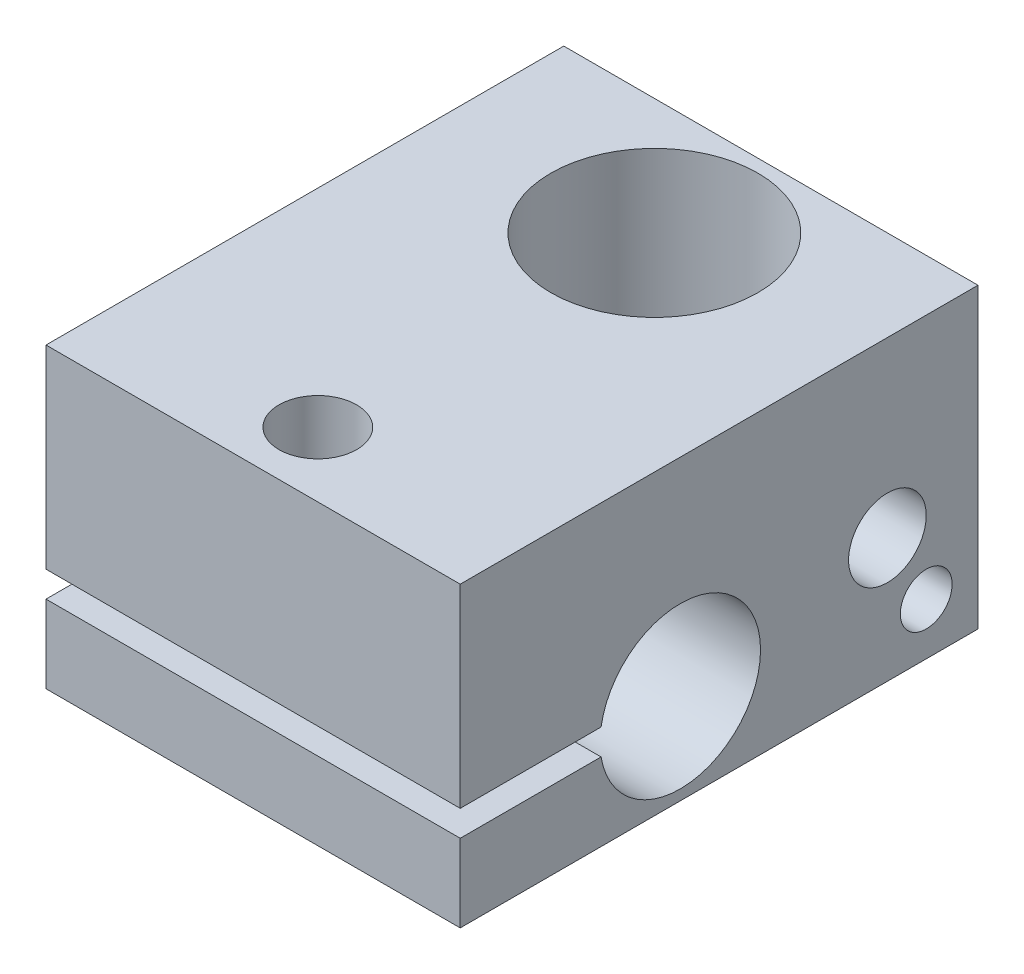
ISO-10303-21;
HEADER;
FILE_DESCRIPTION(('STEP AP214'),'2;1');
FILE_NAME('part.step','',(''),(''),'','','');
FILE_SCHEMA(('AUTOMOTIVE_DESIGN { 1 0 10303 214 1 1 1 1 }'));
ENDSEC;
DATA;
#1=APPLICATION_CONTEXT('core data for automotive mechanical design processes');
#2=APPLICATION_PROTOCOL_DEFINITION('international standard','automotive_design',2000,#1);
#3=PRODUCT_CONTEXT('',#1,'mechanical');
#4=PRODUCT('Part','Part','',(#3));
#5=PRODUCT_RELATED_PRODUCT_CATEGORY('part','',(#4));
#6=PRODUCT_DEFINITION_FORMATION('','',#4);
#7=PRODUCT_DEFINITION_CONTEXT('part definition',#1,'design');
#8=PRODUCT_DEFINITION('design','',#6,#7);
#9=PRODUCT_DEFINITION_SHAPE('','',#8);
#10=(LENGTH_UNIT() NAMED_UNIT(*) SI_UNIT(.MILLI.,.METRE.));
#11=(NAMED_UNIT(*) PLANE_ANGLE_UNIT() SI_UNIT($,.RADIAN.));
#12=(NAMED_UNIT(*) SI_UNIT($,.STERADIAN.) SOLID_ANGLE_UNIT());
#13=UNCERTAINTY_MEASURE_WITH_UNIT(LENGTH_MEASURE(1.E-05),#10,'distance_accuracy_value','');
#14=(GEOMETRIC_REPRESENTATION_CONTEXT(3) GLOBAL_UNCERTAINTY_ASSIGNED_CONTEXT((#13)) GLOBAL_UNIT_ASSIGNED_CONTEXT((#10,
#11,#12)) REPRESENTATION_CONTEXT('',''));
#15=CARTESIAN_POINT('',(0.,0.,0.));
#16=DIRECTION('',(0.,0.,1.));
#17=DIRECTION('',(1.,0.,0.));
#18=AXIS2_PLACEMENT_3D('',#15,#16,#17);
#19=CARTESIAN_POINT('',(16.,0.,0.));
#20=DIRECTION('',(0.,0.,-1.));
#21=DIRECTION('',(-1.,0.,0.));
#22=AXIS2_PLACEMENT_3D('',#19,#20,#21);
#23=PLANE('',#22);
#24=DIRECTION('',(1.,0.,0.));
#25=VECTOR('',#24,1.);
#26=CARTESIAN_POINT('',(0.,3.,0.));
#27=LINE('',#26,#25);
#28=CARTESIAN_POINT('',(0.,3.,0.));
#29=VERTEX_POINT('',#28);
#30=CARTESIAN_POINT('',(16.,3.,0.));
#31=VERTEX_POINT('',#30);
#32=EDGE_CURVE('E118',#29,#31,#27,.T.);
#33=ORIENTED_EDGE('',*,*,#32,.F.);
#34=DIRECTION('',(0.,-1.,0.));
#35=VECTOR('',#34,1.);
#36=CARTESIAN_POINT('',(0.,0.,0.));
#37=LINE('',#36,#35);
#38=CARTESIAN_POINT('',(0.,0.,0.));
#39=VERTEX_POINT('',#38);
#40=EDGE_CURVE('E126',#29,#39,#37,.T.);
#41=ORIENTED_EDGE('',*,*,#40,.T.);
#42=DIRECTION('',(-1.,0.,0.));
#43=VECTOR('',#42,1.);
#44=CARTESIAN_POINT('',(16.,0.,0.));
#45=LINE('',#44,#43);
#46=CARTESIAN_POINT('',(16.,0.,0.));
#47=VERTEX_POINT('',#46);
#48=EDGE_CURVE('E11',#47,#39,#45,.T.);
#49=ORIENTED_EDGE('',*,*,#48,.F.);
#50=DIRECTION('',(0.,-1.,0.));
#51=VECTOR('',#50,1.);
#52=CARTESIAN_POINT('',(16.,0.,0.));
#53=LINE('',#52,#51);
#54=EDGE_CURVE('E91',#31,#47,#53,.T.);
#55=ORIENTED_EDGE('',*,*,#54,.F.);
#56=EDGE_LOOP('',(#33,#41,#49,#55));
#57=FACE_BOUND('',#56,.T.);
#58=ADVANCED_FACE('F33',(#57),#23,.F.);
#59=CARTESIAN_POINT('',(8.,0.,-2.5));
#60=DIRECTION('',(0.,1.,0.));
#61=DIRECTION('',(0.,0.,1.));
#62=AXIS2_PLACEMENT_3D('',#59,#60,#61);
#63=CYLINDRICAL_SURFACE('',#62,1.5);
#64=CARTESIAN_POINT('',(8.,0.,-2.5));
#65=DIRECTION('',(0.,1.,0.));
#66=DIRECTION('',(0.,0.,1.));
#67=AXIS2_PLACEMENT_3D('',#64,#65,#66);
#68=CIRCLE('',#67,1.5);
#69=CARTESIAN_POINT('',(8.,0.,-1.));
#70=VERTEX_POINT('',#69);
#71=EDGE_CURVE('E135',#70,#70,#68,.T.);
#72=ORIENTED_EDGE('',*,*,#71,.F.);
#73=EDGE_LOOP('',(#72));
#74=FACE_BOUND('',#73,.T.);
#75=CARTESIAN_POINT('',(8.,3.,-2.5));
#76=DIRECTION('',(0.,1.,0.));
#77=DIRECTION('',(0.,0.,1.));
#78=AXIS2_PLACEMENT_3D('',#75,#76,#77);
#79=CIRCLE('',#78,1.5);
#80=CARTESIAN_POINT('',(8.,3.,-1.));
#81=VERTEX_POINT('',#80);
#82=EDGE_CURVE('E154',#81,#81,#79,.F.);
#83=ORIENTED_EDGE('',*,*,#82,.F.);
#84=EDGE_LOOP('',(#83));
#85=FACE_BOUND('',#84,.T.);
#86=ADVANCED_FACE('F231',(#74,#85),#63,.F.);
#87=CARTESIAN_POINT('',(0.,11.5,0.));
#88=VERTEX_POINT('',#87);
#89=CARTESIAN_POINT('',(0.,4.,0.));
#90=VERTEX_POINT('',#89);
#91=EDGE_CURVE('E134',#88,#90,#37,.T.);
#92=ORIENTED_EDGE('',*,*,#91,.T.);
#93=DIRECTION('',(1.,0.,0.));
#94=VECTOR('',#93,1.);
#95=CARTESIAN_POINT('',(0.,4.,0.));
#96=LINE('',#95,#94);
#97=CARTESIAN_POINT('',(16.,4.,0.));
#98=VERTEX_POINT('',#97);
#99=EDGE_CURVE('E157',#90,#98,#96,.T.);
#100=ORIENTED_EDGE('',*,*,#99,.T.);
#101=CARTESIAN_POINT('',(16.,11.5,0.));
#102=VERTEX_POINT('',#101);
#103=EDGE_CURVE('E187',#102,#98,#53,.T.);
#104=ORIENTED_EDGE('',*,*,#103,.F.);
#105=DIRECTION('',(-1.,0.,0.));
#106=VECTOR('',#105,1.);
#107=CARTESIAN_POINT('',(16.,11.5,0.));
#108=LINE('',#107,#106);
#109=EDGE_CURVE('E148',#102,#88,#108,.T.);
#110=ORIENTED_EDGE('',*,*,#109,.T.);
#111=EDGE_LOOP('',(#92,#100,#104,#110));
#112=FACE_BOUND('',#111,.T.);
#113=ADVANCED_FACE('F35',(#112),#23,.F.);
#114=CARTESIAN_POINT('',(16.,0.,0.));
#115=DIRECTION('',(0.,1.,0.));
#116=DIRECTION('',(0.,0.,1.));
#117=AXIS2_PLACEMENT_3D('',#114,#115,#116);
#118=PLANE('',#117);
#119=ORIENTED_EDGE('',*,*,#71,.T.);
#120=EDGE_LOOP('',(#119));
#121=FACE_BOUND('',#120,.T.);
#122=CARTESIAN_POINT('',(8.,0.,-15.5));
#123=DIRECTION('',(0.,1.,0.));
#124=DIRECTION('',(0.,0.,1.));
#125=AXIS2_PLACEMENT_3D('',#122,#123,#124);
#126=CIRCLE('',#125,4.);
#127=CARTESIAN_POINT('',(8.,0.,-11.5));
#128=VERTEX_POINT('',#127);
#129=EDGE_CURVE('E182',#128,#128,#126,.T.);
#130=ORIENTED_EDGE('',*,*,#129,.T.);
#131=EDGE_LOOP('',(#130));
#132=FACE_BOUND('',#131,.T.);
#133=DIRECTION('',(0.,0.,-1.));
#134=VECTOR('',#133,1.);
#135=CARTESIAN_POINT('',(0.,0.,0.));
#136=LINE('',#135,#134);
#137=CARTESIAN_POINT('',(0.,0.,-20.));
#138=VERTEX_POINT('',#137);
#139=EDGE_CURVE('E133',#39,#138,#136,.T.);
#140=ORIENTED_EDGE('',*,*,#139,.T.);
#141=DIRECTION('',(-1.,0.,0.));
#142=VECTOR('',#141,1.);
#143=CARTESIAN_POINT('',(16.,0.,-20.));
#144=LINE('',#143,#142);
#145=CARTESIAN_POINT('',(16.,0.,-20.));
#146=VERTEX_POINT('',#145);
#147=EDGE_CURVE('E46',#146,#138,#144,.T.);
#148=ORIENTED_EDGE('',*,*,#147,.F.);
#149=DIRECTION('',(0.,0.,-1.));
#150=VECTOR('',#149,1.);
#151=CARTESIAN_POINT('',(16.,0.,0.));
#152=LINE('',#151,#150);
#153=EDGE_CURVE('E189',#47,#146,#152,.T.);
#154=ORIENTED_EDGE('',*,*,#153,.F.);
#155=ORIENTED_EDGE('',*,*,#48,.T.);
#156=EDGE_LOOP('',(#140,#148,#154,#155));
#157=FACE_BOUND('',#156,.T.);
#158=ADVANCED_FACE('F239',(#121,#132,#157),#118,.F.);
#159=CARTESIAN_POINT('',(16.,0.,-20.));
#160=DIRECTION('',(0.,0.,1.));
#161=DIRECTION('',(1.,0.,0.));
#162=AXIS2_PLACEMENT_3D('',#159,#160,#161);
#163=PLANE('',#162);
#164=DIRECTION('',(0.,1.,0.));
#165=VECTOR('',#164,1.);
#166=CARTESIAN_POINT('',(0.,0.,-20.));
#167=LINE('',#166,#165);
#168=CARTESIAN_POINT('',(0.,11.5,-20.));
#169=VERTEX_POINT('',#168);
#170=EDGE_CURVE('E145',#138,#169,#167,.T.);
#171=ORIENTED_EDGE('',*,*,#170,.T.);
#172=DIRECTION('',(-1.,0.,0.));
#173=VECTOR('',#172,1.);
#174=CARTESIAN_POINT('',(16.,11.5,-20.));
#175=LINE('',#174,#173);
#176=CARTESIAN_POINT('',(16.,11.5,-20.));
#177=VERTEX_POINT('',#176);
#178=EDGE_CURVE('E150',#177,#169,#175,.T.);
#179=ORIENTED_EDGE('',*,*,#178,.F.);
#180=DIRECTION('',(0.,1.,0.));
#181=VECTOR('',#180,1.);
#182=CARTESIAN_POINT('',(16.,0.,-20.));
#183=LINE('',#182,#181);
#184=EDGE_CURVE('E190',#146,#177,#183,.T.);
#185=ORIENTED_EDGE('',*,*,#184,.F.);
#186=ORIENTED_EDGE('',*,*,#147,.T.);
#187=EDGE_LOOP('',(#171,#179,#185,#186));
#188=FACE_BOUND('',#187,.T.);
#189=ADVANCED_FACE('F196',(#188),#163,.F.);
#190=CARTESIAN_POINT('',(16.,11.5,0.));
#191=DIRECTION('',(0.,-1.,0.));
#192=DIRECTION('',(0.,0.,-1.));
#193=AXIS2_PLACEMENT_3D('',#190,#191,#192);
#194=PLANE('',#193);
#195=CARTESIAN_POINT('',(8.,11.5,-2.5));
#196=DIRECTION('',(0.,1.,0.));
#197=DIRECTION('',(0.,0.,1.));
#198=AXIS2_PLACEMENT_3D('',#195,#196,#197);
#199=CIRCLE('',#198,1.5);
#200=CARTESIAN_POINT('',(8.,11.5,-1.));
#201=VERTEX_POINT('',#200);
#202=EDGE_CURVE('E139',#201,#201,#199,.T.);
#203=ORIENTED_EDGE('',*,*,#202,.F.);
#204=EDGE_LOOP('',(#203));
#205=FACE_BOUND('',#204,.T.);
#206=CARTESIAN_POINT('',(8.,11.5,-15.5));
#207=DIRECTION('',(0.,1.,0.));
#208=DIRECTION('',(0.,0.,1.));
#209=AXIS2_PLACEMENT_3D('',#206,#207,#208);
#210=CIRCLE('',#209,4.);
#211=CARTESIAN_POINT('',(8.,11.5,-11.5));
#212=VERTEX_POINT('',#211);
#213=EDGE_CURVE('E177',#212,#212,#210,.T.);
#214=ORIENTED_EDGE('',*,*,#213,.F.);
#215=EDGE_LOOP('',(#214));
#216=FACE_BOUND('',#215,.T.);
#217=DIRECTION('',(0.,0.,1.));
#218=VECTOR('',#217,1.);
#219=CARTESIAN_POINT('',(0.,11.5,0.));
#220=LINE('',#219,#218);
#221=EDGE_CURVE('E84',#169,#88,#220,.T.);
#222=ORIENTED_EDGE('',*,*,#221,.T.);
#223=ORIENTED_EDGE('',*,*,#109,.F.);
#224=DIRECTION('',(0.,0.,1.));
#225=VECTOR('',#224,1.);
#226=CARTESIAN_POINT('',(16.,11.5,0.));
#227=LINE('',#226,#225);
#228=EDGE_CURVE('E63',#177,#102,#227,.T.);
#229=ORIENTED_EDGE('',*,*,#228,.F.);
#230=ORIENTED_EDGE('',*,*,#178,.T.);
#231=EDGE_LOOP('',(#222,#223,#229,#230));
#232=FACE_BOUND('',#231,.T.);
#233=ADVANCED_FACE('F197',(#205,#216,#232),#194,.F.);
#234=CARTESIAN_POINT('',(16.,0.,0.));
#235=DIRECTION('',(-1.,0.,0.));
#236=DIRECTION('',(0.,0.,1.));
#237=AXIS2_PLACEMENT_3D('',#234,#235,#236);
#238=PLANE('',#237);
#239=CARTESIAN_POINT('',(16.,4.8,-16.5));
#240=DIRECTION('',(1.,0.,0.));
#241=DIRECTION('',(0.,0.,-1.));
#242=AXIS2_PLACEMENT_3D('',#239,#240,#241);
#243=CIRCLE('',#242,1.5);
#244=CARTESIAN_POINT('',(16.,4.8,-18.));
#245=VERTEX_POINT('',#244);
#246=EDGE_CURVE('E162',#245,#245,#243,.T.);
#247=ORIENTED_EDGE('',*,*,#246,.F.);
#248=EDGE_LOOP('',(#247));
#249=FACE_BOUND('',#248,.T.);
#250=CARTESIAN_POINT('',(16.,2.,-18.));
#251=DIRECTION('',(1.,0.,0.));
#252=DIRECTION('',(0.,0.,-1.));
#253=AXIS2_PLACEMENT_3D('',#250,#251,#252);
#254=CIRCLE('',#253,1.);
#255=CARTESIAN_POINT('',(16.,2.,-19.));
#256=VERTEX_POINT('',#255);
#257=EDGE_CURVE('E171',#256,#256,#254,.T.);
#258=ORIENTED_EDGE('',*,*,#257,.F.);
#259=EDGE_LOOP('',(#258));
#260=FACE_BOUND('',#259,.T.);
#261=ORIENTED_EDGE('',*,*,#103,.T.);
#262=DIRECTION('',(0.,0.,1.));
#263=VECTOR('',#262,1.);
#264=CARTESIAN_POINT('',(16.,4.,0.));
#265=LINE('',#264,#263);
#266=CARTESIAN_POINT('',(16.,4.,-5.44058829184433));
#267=VERTEX_POINT('',#266);
#268=EDGE_CURVE('E122',#267,#98,#265,.T.);
#269=ORIENTED_EDGE('',*,*,#268,.F.);
#270=CARTESIAN_POINT('',(16.,3.5,-8.5));
#271=DIRECTION('',(1.,0.,0.));
#272=DIRECTION('',(0.,0.,-1.));
#273=AXIS2_PLACEMENT_3D('',#270,#271,#272);
#274=CIRCLE('',#273,3.1);
#275=CARTESIAN_POINT('',(16.,3.,-5.44058829184433));
#276=VERTEX_POINT('',#275);
#277=EDGE_CURVE('E205',#276,#267,#274,.T.);
#278=ORIENTED_EDGE('',*,*,#277,.F.);
#279=DIRECTION('',(0.,0.,1.));
#280=VECTOR('',#279,1.);
#281=CARTESIAN_POINT('',(16.,3.,0.));
#282=LINE('',#281,#280);
#283=EDGE_CURVE('E208',#276,#31,#282,.T.);
#284=ORIENTED_EDGE('',*,*,#283,.T.);
#285=ORIENTED_EDGE('',*,*,#54,.T.);
#286=ORIENTED_EDGE('',*,*,#153,.T.);
#287=ORIENTED_EDGE('',*,*,#184,.T.);
#288=ORIENTED_EDGE('',*,*,#228,.T.);
#289=EDGE_LOOP('',(#261,#269,#278,#284,#285,#286,#287,#288));
#290=FACE_BOUND('',#289,.T.);
#291=ADVANCED_FACE('F193',(#249,#260,#290),#238,.F.);
#292=CARTESIAN_POINT('',(0.,0.,0.));
#293=DIRECTION('',(-1.,0.,0.));
#294=DIRECTION('',(0.,0.,1.));
#295=AXIS2_PLACEMENT_3D('',#292,#293,#294);
#296=PLANE('',#295);
#297=DIRECTION('',(0.,0.,1.));
#298=VECTOR('',#297,1.);
#299=CARTESIAN_POINT('',(0.,4.,0.));
#300=LINE('',#299,#298);
#301=CARTESIAN_POINT('',(0.,4.,-5.44058829184433));
#302=VERTEX_POINT('',#301);
#303=EDGE_CURVE('E128',#302,#90,#300,.T.);
#304=ORIENTED_EDGE('',*,*,#303,.T.);
#305=ORIENTED_EDGE('',*,*,#91,.F.);
#306=ORIENTED_EDGE('',*,*,#221,.F.);
#307=ORIENTED_EDGE('',*,*,#170,.F.);
#308=ORIENTED_EDGE('',*,*,#139,.F.);
#309=ORIENTED_EDGE('',*,*,#40,.F.);
#310=DIRECTION('',(0.,0.,1.));
#311=VECTOR('',#310,1.);
#312=CARTESIAN_POINT('',(0.,3.,0.));
#313=LINE('',#312,#311);
#314=CARTESIAN_POINT('',(0.,3.,-5.44058829184433));
#315=VERTEX_POINT('',#314);
#316=EDGE_CURVE('E113',#315,#29,#313,.T.);
#317=ORIENTED_EDGE('',*,*,#316,.F.);
#318=CARTESIAN_POINT('',(0.,3.5,-8.5));
#319=DIRECTION('',(1.,0.,0.));
#320=DIRECTION('',(0.,0.,-1.));
#321=AXIS2_PLACEMENT_3D('',#318,#319,#320);
#322=CIRCLE('',#321,3.1);
#323=EDGE_CURVE('E54',#315,#302,#322,.T.);
#324=ORIENTED_EDGE('',*,*,#323,.T.);
#325=EDGE_LOOP('',(#304,#305,#306,#307,#308,#309,#317,#324));
#326=FACE_BOUND('',#325,.T.);
#327=ADVANCED_FACE('F131',(#326),#296,.T.);
#328=CARTESIAN_POINT('',(8.,0.,-15.5));
#329=DIRECTION('',(0.,1.,0.));
#330=DIRECTION('',(0.,0.,1.));
#331=AXIS2_PLACEMENT_3D('',#328,#329,#330);
#332=CYLINDRICAL_SURFACE('',#331,4.);
#333=CARTESIAN_POINT('',(8.,2.71897503240933,-11.5));
#334=CARTESIAN_POINT('',(8.05131313950269,2.71897531900269,-11.5000004188162));
#335=CARTESIAN_POINT('',(8.10263374667161,2.72276682481019,-11.5009949431988));
#336=CARTESIAN_POINT('',(8.20407962783646,2.73795261633839,-11.5048867873232));
#337=CARTESIAN_POINT('',(8.25420465005612,2.74934848906218,-11.5077845042522));
#338=CARTESIAN_POINT('',(8.35208684528314,2.77980766250273,-11.5152229151639));
#339=CARTESIAN_POINT('',(8.39983839047968,2.79888829343133,-11.5197673203214));
#340=CARTESIAN_POINT('',(8.49142560793803,2.84468406443642,-11.5300346641971));
#341=CARTESIAN_POINT('',(8.53526115849629,2.87139944168168,-11.5357576395254));
#342=CARTESIAN_POINT('',(8.61769747382015,2.93243661987816,-11.547760408997));
#343=CARTESIAN_POINT('',(8.65626128799973,2.9668080722286,-11.5540436694767));
#344=CARTESIAN_POINT('',(8.72602397268553,3.04241991241141,-11.5662807368399));
#345=CARTESIAN_POINT('',(8.75722893428962,3.08365457083207,-11.5722348130493));
#346=CARTESIAN_POINT('',(8.80728897261027,3.16635078634622,-11.5822381964399));
#347=CARTESIAN_POINT('',(8.82719068323198,3.20716126560548,-11.5864316825361));
#348=CARTESIAN_POINT('',(8.85903758053787,3.29189349201759,-11.593297589777));
#349=CARTESIAN_POINT('',(8.87098940977277,3.33581260769961,-11.5959712805195));
#350=CARTESIAN_POINT('',(8.88547887772341,3.42035630519952,-11.5992340311775));
#351=CARTESIAN_POINT('',(8.88889315492156,3.46082504701153,-11.6000168935454));
#352=CARTESIAN_POINT('',(8.88874339715854,3.541743399242,-11.5999825745555));
#353=CARTESIAN_POINT('',(8.88518151145835,3.58219301171369,-11.5991658859975));
#354=CARTESIAN_POINT('',(8.87152783358616,3.66021307795255,-11.5960937256625));
#355=CARTESIAN_POINT('',(8.86170628619197,3.69783379359426,-11.5938978511973));
#356=CARTESIAN_POINT('',(8.83618785274075,3.77092822881878,-11.5883559584495));
#357=CARTESIAN_POINT('',(8.82049062686092,3.80640182408392,-11.5850098736449));
#358=CARTESIAN_POINT('',(8.78322086239355,3.87545914364336,-11.5773814547988));
#359=CARTESIAN_POINT('',(8.76147880474574,3.90894811951714,-11.573072945751));
#360=CARTESIAN_POINT('',(8.71312182242167,3.97212049731888,-11.5640043793728));
#361=CARTESIAN_POINT('',(8.68650540124057,4.00180272574494,-11.5592441835845));
#362=CARTESIAN_POINT('',(8.62669536884645,4.059343291498,-11.5492724459394));
#363=CARTESIAN_POINT('',(8.59312973905303,4.08681369681706,-11.5440579157409));
#364=CARTESIAN_POINT('',(8.52221717017484,4.13642709699357,-11.5340735374285));
#365=CARTESIAN_POINT('',(8.48486854898347,4.15856770705266,-11.5293038889578));
#366=CARTESIAN_POINT('',(8.40279524132106,4.19966293965357,-11.520094053122));
#367=CARTESIAN_POINT('',(8.35771920854484,4.21793935413189,-11.5157581130541));
#368=CARTESIAN_POINT('',(8.26525215314653,4.24763127740892,-11.5085346025686));
#369=CARTESIAN_POINT('',(8.21786000015447,4.25904339923102,-11.5056477472739));
#370=CARTESIAN_POINT('',(8.11674493905827,4.27587163955196,-11.5013512683095));
#371=CARTESIAN_POINT('',(8.06288513573132,4.28052020034476,-11.5001316000837));
#372=CARTESIAN_POINT('',(7.95507496437734,4.28145229516197,-11.4998885600893));
#373=CARTESIAN_POINT('',(7.90112456802553,4.27773235390019,-11.5008661007813));
#374=CARTESIAN_POINT('',(7.79197015069677,4.26152109125874,-11.5050226060568));
#375=CARTESIAN_POINT('',(7.73683022570889,4.2486173824228,-11.5083049696896));
#376=CARTESIAN_POINT('',(7.62970669398307,4.21355196277179,-11.5168141831741));
#377=CARTESIAN_POINT('',(7.57772296110955,4.19139062221245,-11.5220409552589));
#378=CARTESIAN_POINT('',(7.48088732980444,4.13899929663716,-11.5335402851028));
#379=CARTESIAN_POINT('',(7.43582927466983,4.10914132593094,-11.539760590532));
#380=CARTESIAN_POINT('',(7.35230618252153,4.0413466862028,-11.5525605888023));
#381=CARTESIAN_POINT('',(7.31383523088801,4.00341733392571,-11.559139952166));
#382=CARTESIAN_POINT('',(7.2494313791002,3.92517110901235,-11.5709291949039));
#383=CARTESIAN_POINT('',(7.2225636839256,3.88563556142571,-11.57620948499));
#384=CARTESIAN_POINT('',(7.17687897350901,3.8020262283264,-11.5855371250882));
#385=CARTESIAN_POINT('',(7.15805400332078,3.75795698082916,-11.5895856922335));
#386=CARTESIAN_POINT('',(7.13126198548157,3.67248749353017,-11.595456640336));
#387=CARTESIAN_POINT('',(7.12224055462888,3.63143051875985,-11.5974923147353));
#388=CARTESIAN_POINT('',(7.11159576250307,3.54832474120136,-11.5999013350687));
#389=CARTESIAN_POINT('',(7.10996885266413,3.50627642389029,-11.6002754783549));
#390=CARTESIAN_POINT('',(7.1140405944028,3.42543311275319,-11.5993490265292));
#391=CARTESIAN_POINT('',(7.11924949113661,3.38661102637392,-11.5981603869019));
#392=CARTESIAN_POINT('',(7.13593184174631,3.31041220982688,-11.5944323722563));
#393=CARTESIAN_POINT('',(7.14740489066375,3.27303538639448,-11.5918930845536));
#394=CARTESIAN_POINT('',(7.17624972220147,3.2004680915242,-11.5857117497797));
#395=CARTESIAN_POINT('',(7.19365816022494,3.16529285392416,-11.5820628656464));
#396=CARTESIAN_POINT('',(7.23371425416741,3.09816667576094,-11.5740323364481));
#397=CARTESIAN_POINT('',(7.25636307436059,3.06621645397987,-11.5696505286068));
#398=CARTESIAN_POINT('',(7.30789293938892,3.00401933290229,-11.5602387987639));
#399=CARTESIAN_POINT('',(7.33709755144524,2.97404479779137,-11.5551850002575));
#400=CARTESIAN_POINT('',(7.39971725905683,2.91886564241682,-11.545171768717));
#401=CARTESIAN_POINT('',(7.43313424622968,2.89366317791074,-11.5402123792371));
#402=CARTESIAN_POINT('',(7.50714458298747,2.84575607518653,-11.5302853866124));
#403=CARTESIAN_POINT('',(7.54812290955392,2.8236344420493,-11.5253773324042));
#404=CARTESIAN_POINT('',(7.6329952464275,2.7856879053515,-11.516643494064));
#405=CARTESIAN_POINT('',(7.6768900769868,2.76986478203751,-11.5128180160057));
#406=CARTESIAN_POINT('',(7.76684651606758,2.74444607269744,-11.5065447223917));
#407=CARTESIAN_POINT('',(7.81292047338869,2.73489211610646,-11.5041061301969));
#408=CARTESIAN_POINT('',(7.90599410731891,2.72215599165549,-11.5008334580516));
#409=CARTESIAN_POINT('',(7.95299392033192,2.71897476987169,-11.4999996163379));
#410=CARTESIAN_POINT('',(8.,2.71897503240933,-11.5));
#411=B_SPLINE_CURVE_WITH_KNOTS('',3,(#333,#334,#335,#336,#337,#338,#339,#340,#341,#342,#343,
#344,#345,#346,#347,#348,#349,#350,#351,#352,#353,#354,#355,#356,#357,#358,#359,#360,#361,#362,
#363,#364,#365,#366,#367,#368,#369,#370,#371,#372,#373,#374,#375,#376,#377,#378,#379,#380,#381,
#382,#383,#384,#385,#386,#387,#388,#389,#390,#391,#392,#393,#394,#395,#396,#397,#398,#399,#400,
#401,#402,#403,#404,#405,#406,#407,#408,#409,#410),.UNSPECIFIED.,.T.,.F.,(4,2,2,2,2,2,2,2,2,2,2,
2,2,2,2,2,2,2,2,2,2,2,2,2,2,2,2,2,2,2,2,2,2,2,2,2,2,2,4),(0.,0.153801464245608,0.30763503632736,
0.461817484842247,0.616004723462352,0.771222626059928,0.926311596574024,1.06233464365199,
1.19824389295602,1.31948862529856,1.44069600966287,1.55699554052924,1.67330179867701,
1.79327223433104,1.91327956469818,2.04380611077569,2.17439095239469,2.32029109978311,
2.46626317823548,2.62777338714978,2.78935068068741,2.9586823776719,3.128007302943,
3.29032236817519,3.45249091611726,3.59593511522016,3.73923710536347,3.86482853330059,
3.99035968464417,4.10736992210943,4.22437259611278,4.34211134480957,4.45987627710049,
4.58581927160675,4.71181902516006,4.85173029838146,4.99168108888739,5.1325520413564,
5.27344390553512),.UNSPECIFIED.);
#412=CARTESIAN_POINT('',(8.,2.71897503240933,-11.5));
#413=VERTEX_POINT('',#412);
#414=EDGE_CURVE('E37',#413,#413,#411,.T.);
#415=ORIENTED_EDGE('',*,*,#414,.T.);
#416=EDGE_LOOP('',(#415));
#417=FACE_BOUND('',#416,.T.);
#418=ORIENTED_EDGE('',*,*,#129,.F.);
#419=EDGE_LOOP('',(#418));
#420=FACE_BOUND('',#419,.T.);
#421=ORIENTED_EDGE('',*,*,#213,.T.);
#422=EDGE_LOOP('',(#421));
#423=FACE_BOUND('',#422,.T.);
#424=ADVANCED_FACE('F255',(#417,#420,#423),#332,.F.);
#425=CARTESIAN_POINT('',(8.,4.,-2.5));
#426=DIRECTION('',(0.,1.,0.));
#427=DIRECTION('',(0.,0.,1.));
#428=AXIS2_PLACEMENT_3D('',#425,#426,#427);
#429=CIRCLE('',#428,1.5);
#430=CARTESIAN_POINT('',(8.,4.,-1.));
#431=VERTEX_POINT('',#430);
#432=EDGE_CURVE('E156',#431,#431,#429,.F.);
#433=ORIENTED_EDGE('',*,*,#432,.T.);
#434=EDGE_LOOP('',(#433));
#435=FACE_BOUND('',#434,.T.);
#436=ORIENTED_EDGE('',*,*,#202,.T.);
#437=EDGE_LOOP('',(#436));
#438=FACE_BOUND('',#437,.T.);
#439=ADVANCED_FACE('F237',(#435,#438),#63,.F.);
#440=CARTESIAN_POINT('',(14.,2.,-18.));
#441=DIRECTION('',(1.,0.,0.));
#442=DIRECTION('',(0.,0.,-1.));
#443=AXIS2_PLACEMENT_3D('',#440,#441,#442);
#444=CYLINDRICAL_SURFACE('',#443,1.);
#445=CARTESIAN_POINT('',(14.,2.,-18.));
#446=DIRECTION('',(1.,0.,0.));
#447=DIRECTION('',(0.,0.,-1.));
#448=AXIS2_PLACEMENT_3D('',#445,#446,#447);
#449=CIRCLE('',#448,1.);
#450=CARTESIAN_POINT('',(14.,2.,-19.));
#451=VERTEX_POINT('',#450);
#452=EDGE_CURVE('E174',#451,#451,#449,.T.);
#453=ORIENTED_EDGE('',*,*,#452,.F.);
#454=EDGE_LOOP('',(#453));
#455=FACE_BOUND('',#454,.T.);
#456=ORIENTED_EDGE('',*,*,#257,.T.);
#457=EDGE_LOOP('',(#456));
#458=FACE_BOUND('',#457,.T.);
#459=ADVANCED_FACE('F262',(#455,#458),#444,.F.);
#460=CARTESIAN_POINT('',(14.,0.,0.));
#461=DIRECTION('',(1.,0.,0.));
#462=DIRECTION('',(0.,0.,-1.));
#463=AXIS2_PLACEMENT_3D('',#460,#461,#462);
#464=PLANE('',#463);
#465=ORIENTED_EDGE('',*,*,#452,.T.);
#466=EDGE_LOOP('',(#465));
#467=FACE_BOUND('',#466,.T.);
#468=ADVANCED_FACE('F265',(#467),#464,.T.);
#469=CARTESIAN_POINT('',(12.2,4.8,-16.5));
#470=DIRECTION('',(1.,0.,0.));
#471=DIRECTION('',(0.,0.,-1.));
#472=AXIS2_PLACEMENT_3D('',#469,#470,#471);
#473=CYLINDRICAL_SURFACE('',#472,1.5);
#474=CARTESIAN_POINT('',(12.2,4.8,-16.5));
#475=DIRECTION('',(1.,0.,0.));
#476=DIRECTION('',(0.,0.,-1.));
#477=AXIS2_PLACEMENT_3D('',#474,#475,#476);
#478=CIRCLE('',#477,1.5);
#479=CARTESIAN_POINT('',(12.2,4.8,-18.));
#480=VERTEX_POINT('',#479);
#481=EDGE_CURVE('E166',#480,#480,#478,.T.);
#482=CARTESIAN_POINT('',(12.2,4.8,-18.));
#483=CARTESIAN_POINT('',(12.2395833333333,4.8,-18.));
#484=CARTESIAN_POINT('',(12.2791666666667,4.8,-18.));
#485=CARTESIAN_POINT('',(12.3583333333333,4.8,-18.));
#486=CARTESIAN_POINT('',(12.3979166666667,4.8,-18.));
#487=CARTESIAN_POINT('',(12.4770833333333,4.8,-18.));
#488=CARTESIAN_POINT('',(12.5166666666667,4.8,-18.));
#489=CARTESIAN_POINT('',(12.5958333333333,4.8,-18.));
#490=CARTESIAN_POINT('',(12.6354166666667,4.8,-18.));
#491=CARTESIAN_POINT('',(12.7145833333333,4.8,-18.));
#492=CARTESIAN_POINT('',(12.7541666666667,4.8,-18.));
#493=CARTESIAN_POINT('',(12.8333333333333,4.8,-18.));
#494=CARTESIAN_POINT('',(12.8729166666667,4.8,-18.));
#495=CARTESIAN_POINT('',(12.9520833333333,4.8,-18.));
#496=CARTESIAN_POINT('',(12.9916666666667,4.8,-18.));
#497=CARTESIAN_POINT('',(13.0708333333333,4.8,-18.));
#498=CARTESIAN_POINT('',(13.1104166666667,4.8,-18.));
#499=CARTESIAN_POINT('',(13.1895833333333,4.8,-18.));
#500=CARTESIAN_POINT('',(13.2291666666667,4.8,-18.));
#501=CARTESIAN_POINT('',(13.3083333333333,4.8,-18.));
#502=CARTESIAN_POINT('',(13.3479166666667,4.8,-18.));
#503=CARTESIAN_POINT('',(13.4270833333333,4.8,-18.));
#504=CARTESIAN_POINT('',(13.4666666666667,4.8,-18.));
#505=CARTESIAN_POINT('',(13.5458333333333,4.8,-18.));
#506=CARTESIAN_POINT('',(13.5854166666667,4.8,-18.));
#507=CARTESIAN_POINT('',(13.6645833333333,4.8,-18.));
#508=CARTESIAN_POINT('',(13.7041666666667,4.8,-18.));
#509=CARTESIAN_POINT('',(13.7833333333333,4.8,-18.));
#510=CARTESIAN_POINT('',(13.8229166666667,4.8,-18.));
#511=CARTESIAN_POINT('',(13.9020833333333,4.8,-18.));
#512=CARTESIAN_POINT('',(13.9416666666667,4.8,-18.));
#513=CARTESIAN_POINT('',(14.0208333333333,4.8,-18.));
#514=CARTESIAN_POINT('',(14.0604166666667,4.8,-18.));
#515=CARTESIAN_POINT('',(14.1395833333333,4.8,-18.));
#516=CARTESIAN_POINT('',(14.1791666666667,4.8,-18.));
#517=CARTESIAN_POINT('',(14.2583333333333,4.8,-18.));
#518=CARTESIAN_POINT('',(14.2979166666667,4.8,-18.));
#519=CARTESIAN_POINT('',(14.3770833333333,4.8,-18.));
#520=CARTESIAN_POINT('',(14.4166666666667,4.8,-18.));
#521=CARTESIAN_POINT('',(14.4958333333333,4.8,-18.));
#522=CARTESIAN_POINT('',(14.5354166666667,4.8,-18.));
#523=CARTESIAN_POINT('',(14.6145833333333,4.8,-18.));
#524=CARTESIAN_POINT('',(14.6541666666667,4.8,-18.));
#525=CARTESIAN_POINT('',(14.7333333333333,4.8,-18.));
#526=CARTESIAN_POINT('',(14.7729166666667,4.8,-18.));
#527=CARTESIAN_POINT('',(14.8520833333333,4.8,-18.));
#528=CARTESIAN_POINT('',(14.8916666666667,4.8,-18.));
#529=CARTESIAN_POINT('',(14.9708333333333,4.8,-18.));
#530=CARTESIAN_POINT('',(15.0104166666667,4.8,-18.));
#531=CARTESIAN_POINT('',(15.0895833333333,4.8,-18.));
#532=CARTESIAN_POINT('',(15.1291666666667,4.8,-18.));
#533=CARTESIAN_POINT('',(15.2083333333333,4.8,-18.));
#534=CARTESIAN_POINT('',(15.2479166666667,4.8,-18.));
#535=CARTESIAN_POINT('',(15.3270833333333,4.8,-18.));
#536=CARTESIAN_POINT('',(15.3666666666667,4.8,-18.));
#537=CARTESIAN_POINT('',(15.4458333333333,4.8,-18.));
#538=CARTESIAN_POINT('',(15.4854166666667,4.8,-18.));
#539=CARTESIAN_POINT('',(15.5645833333333,4.8,-18.));
#540=CARTESIAN_POINT('',(15.6041666666667,4.8,-18.));
#541=CARTESIAN_POINT('',(15.6833333333333,4.8,-18.));
#542=CARTESIAN_POINT('',(15.7229166666667,4.8,-18.));
#543=CARTESIAN_POINT('',(15.8020833333333,4.8,-18.));
#544=CARTESIAN_POINT('',(15.8416666666667,4.8,-18.));
#545=CARTESIAN_POINT('',(15.9208333333333,4.8,-18.));
#546=CARTESIAN_POINT('',(15.9604166666667,4.8,-18.));
#547=CARTESIAN_POINT('',(16.,4.8,-18.));
#548=B_SPLINE_CURVE_WITH_KNOTS('',3,(#482,#483,#484,#485,#486,#487,#488,#489,#490,#491,#492,
#493,#494,#495,#496,#497,#498,#499,#500,#501,#502,#503,#504,#505,#506,#507,#508,#509,#510,#511,
#512,#513,#514,#515,#516,#517,#518,#519,#520,#521,#522,#523,#524,#525,#526,#527,#528,#529,#530,
#531,#532,#533,#534,#535,#536,#537,#538,#539,#540,#541,#542,#543,#544,#545,#546,#547),
.UNSPECIFIED.,.F.,.F.,(4,2,2,2,2,2,2,2,2,2,2,2,2,2,2,2,2,2,2,2,2,2,2,2,2,2,2,2,2,2,2,2,4),(0.,
0.118749999999999,0.2375,0.356249999999999,0.475,0.593749999999999,0.7125,0.831249999999999,
0.95,1.06875,1.1875,1.30625,1.425,1.54375,1.6625,1.78125,1.9,2.01875,2.1375,2.25625,2.375,
2.49375,2.6125,2.73125,2.85,2.96875,3.0875,3.20625,3.325,3.44375,3.5625,3.68125,3.8),.UNSPECIFIED.);
#549=EDGE_CURVE('BSEAM269',#480,#245,#548,.T.);
#550=ORIENTED_EDGE('',*,*,#481,.F.);
#551=ORIENTED_EDGE('',*,*,#246,.T.);
#552=ORIENTED_EDGE('',*,*,#549,.T.);
#553=ORIENTED_EDGE('',*,*,#549,.F.);
#554=EDGE_LOOP('',(#550,#552,#551,#553));
#555=FACE_BOUND('',#554,.T.);
#556=ADVANCED_FACE('F269',(#555),#473,.F.);
#557=CARTESIAN_POINT('',(12.2,0.,0.));
#558=DIRECTION('',(1.,0.,0.));
#559=DIRECTION('',(0.,0.,-1.));
#560=AXIS2_PLACEMENT_3D('',#557,#558,#559);
#561=PLANE('',#560);
#562=ORIENTED_EDGE('',*,*,#481,.T.);
#563=EDGE_LOOP('',(#562));
#564=FACE_BOUND('',#563,.T.);
#565=ADVANCED_FACE('F229',(#564),#561,.T.);
#566=CARTESIAN_POINT('',(0.,3.5,-8.5));
#567=DIRECTION('',(1.,0.,0.));
#568=DIRECTION('',(0.,0.,-1.));
#569=AXIS2_PLACEMENT_3D('',#566,#567,#568);
#570=CYLINDRICAL_SURFACE('',#569,3.1);
#571=ORIENTED_EDGE('',*,*,#277,.T.);
#572=DIRECTION('',(1.,0.,0.));
#573=VECTOR('',#572,1.);
#574=CARTESIAN_POINT('',(0.,4.,-5.44058829184433));
#575=LINE('',#574,#573);
#576=EDGE_CURVE('E213',#302,#267,#575,.T.);
#577=ORIENTED_EDGE('',*,*,#576,.F.);
#578=ORIENTED_EDGE('',*,*,#323,.F.);
#579=DIRECTION('',(1.,0.,0.));
#580=VECTOR('',#579,1.);
#581=CARTESIAN_POINT('',(0.,3.,-5.44058829184433));
#582=LINE('',#581,#580);
#583=EDGE_CURVE('E119',#315,#276,#582,.T.);
#584=ORIENTED_EDGE('',*,*,#583,.T.);
#585=EDGE_LOOP('',(#571,#577,#578,#584));
#586=FACE_BOUND('',#585,.T.);
#587=ORIENTED_EDGE('',*,*,#414,.F.);
#588=EDGE_LOOP('',(#587));
#589=FACE_BOUND('',#588,.T.);
#590=ADVANCED_FACE('F215',(#586,#589),#570,.F.);
#591=CARTESIAN_POINT('',(0.,4.,0.));
#592=DIRECTION('',(0.,1.,0.));
#593=DIRECTION('',(0.,0.,1.));
#594=AXIS2_PLACEMENT_3D('',#591,#592,#593);
#595=PLANE('',#594);
#596=ORIENTED_EDGE('',*,*,#268,.T.);
#597=ORIENTED_EDGE('',*,*,#99,.F.);
#598=ORIENTED_EDGE('',*,*,#303,.F.);
#599=ORIENTED_EDGE('',*,*,#576,.T.);
#600=EDGE_LOOP('',(#596,#597,#598,#599));
#601=FACE_BOUND('',#600,.T.);
#602=ORIENTED_EDGE('',*,*,#432,.F.);
#603=EDGE_LOOP('',(#602));
#604=FACE_BOUND('',#603,.T.);
#605=ADVANCED_FACE('F220',(#601,#604),#595,.F.);
#606=CARTESIAN_POINT('',(0.,3.,0.));
#607=DIRECTION('',(0.,1.,0.));
#608=DIRECTION('',(0.,0.,1.));
#609=AXIS2_PLACEMENT_3D('',#606,#607,#608);
#610=PLANE('',#609);
#611=ORIENTED_EDGE('',*,*,#283,.F.);
#612=ORIENTED_EDGE('',*,*,#583,.F.);
#613=ORIENTED_EDGE('',*,*,#316,.T.);
#614=ORIENTED_EDGE('',*,*,#32,.T.);
#615=EDGE_LOOP('',(#611,#612,#613,#614));
#616=FACE_BOUND('',#615,.T.);
#617=ORIENTED_EDGE('',*,*,#82,.T.);
#618=EDGE_LOOP('',(#617));
#619=FACE_BOUND('',#618,.T.);
#620=ADVANCED_FACE('F116',(#616,#619),#610,.T.);
#621=CLOSED_SHELL('',(#58,#86,#113,#158,#189,#233,#291,#327,#424,#439,#459,#468,#556,#565,#590,
#605,#620));
#622=MANIFOLD_SOLID_BREP('B2',#621);
#623=ADVANCED_BREP_SHAPE_REPRESENTATION('',(#18,#622),#14);
#624=SHAPE_DEFINITION_REPRESENTATION(#9,#623);
ENDSEC;
END-ISO-10303-21;
